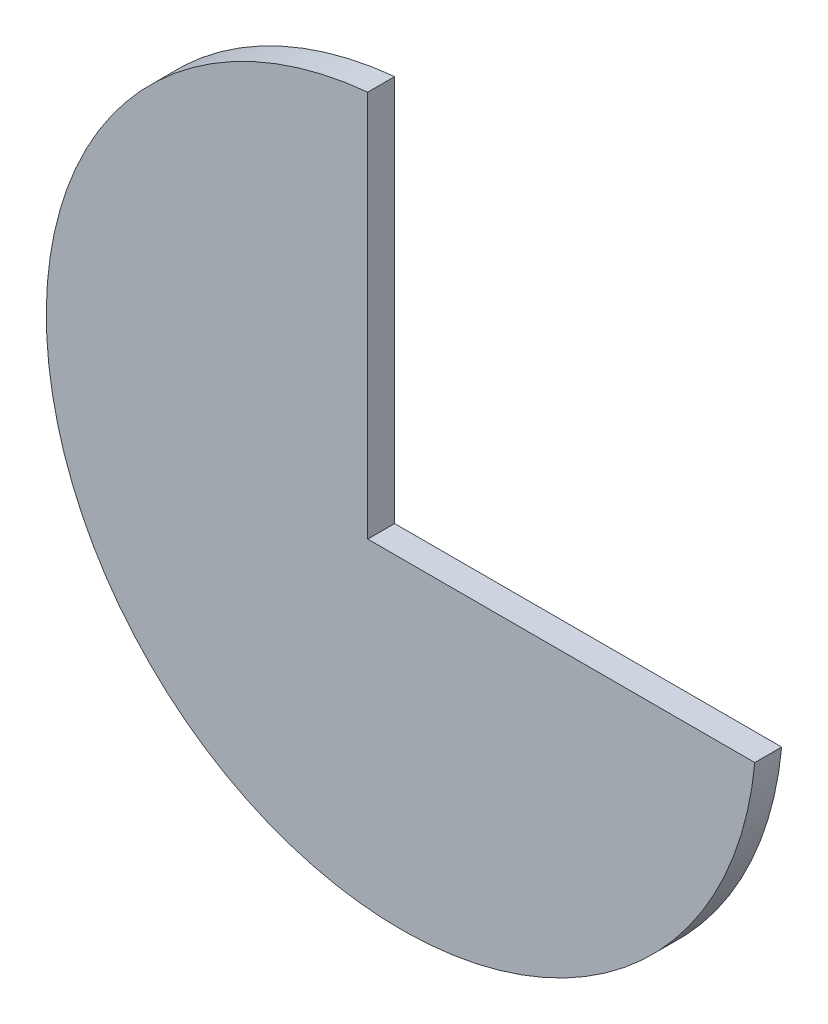
ISO-10303-21;
HEADER;
FILE_DESCRIPTION(('STEP AP214'),'2;1');
FILE_NAME('part.step','',(''),(''),'','','');
FILE_SCHEMA(('AUTOMOTIVE_DESIGN { 1 0 10303 214 1 1 1 1 }'));
ENDSEC;
DATA;
#1=APPLICATION_CONTEXT('core data for automotive mechanical design processes');
#2=APPLICATION_PROTOCOL_DEFINITION('international standard','automotive_design',2000,#1);
#3=PRODUCT_CONTEXT('',#1,'mechanical');
#4=PRODUCT('Part','Part','',(#3));
#5=PRODUCT_RELATED_PRODUCT_CATEGORY('part','',(#4));
#6=PRODUCT_DEFINITION_FORMATION('','',#4);
#7=PRODUCT_DEFINITION_CONTEXT('part definition',#1,'design');
#8=PRODUCT_DEFINITION('design','',#6,#7);
#9=PRODUCT_DEFINITION_SHAPE('','',#8);
#10=(LENGTH_UNIT() NAMED_UNIT(*) SI_UNIT(.MILLI.,.METRE.));
#11=(NAMED_UNIT(*) PLANE_ANGLE_UNIT() SI_UNIT($,.RADIAN.));
#12=(NAMED_UNIT(*) SI_UNIT($,.STERADIAN.) SOLID_ANGLE_UNIT());
#13=UNCERTAINTY_MEASURE_WITH_UNIT(LENGTH_MEASURE(1.E-05),#10,'distance_accuracy_value','');
#14=(GEOMETRIC_REPRESENTATION_CONTEXT(3) GLOBAL_UNCERTAINTY_ASSIGNED_CONTEXT((#13)) GLOBAL_UNIT_ASSIGNED_CONTEXT((#10,
#11,#12)) REPRESENTATION_CONTEXT('',''));
#15=CARTESIAN_POINT('',(0.,0.,0.));
#16=DIRECTION('',(0.,0.,1.));
#17=DIRECTION('',(1.,0.,0.));
#18=AXIS2_PLACEMENT_3D('',#15,#16,#17);
#19=CARTESIAN_POINT('',(-0.025,0.262971339514864,0.01));
#20=DIRECTION('',(1.,0.,0.));
#21=DIRECTION('',(0.,0.,-1.));
#22=AXIS2_PLACEMENT_3D('',#19,#20,#21);
#23=PLANE('',#22);
#24=DIRECTION('',(0.,-1.,0.));
#25=VECTOR('',#24,1.);
#26=CARTESIAN_POINT('',(-0.025,0.262971339514864,-0.01));
#27=LINE('',#26,#25);
#28=CARTESIAN_POINT('',(-0.025,0.262971339514864,-0.01));
#29=VERTEX_POINT('',#28);
#30=CARTESIAN_POINT('',(-0.025,-0.025,-0.01));
#31=VERTEX_POINT('',#30);
#32=EDGE_CURVE('E85',#29,#31,#27,.T.);
#33=ORIENTED_EDGE('',*,*,#32,.F.);
#34=DIRECTION('',(0.,0.,-1.));
#35=VECTOR('',#34,1.);
#36=CARTESIAN_POINT('',(-0.025,0.262971339514864,0.01));
#37=LINE('',#36,#35);
#38=CARTESIAN_POINT('',(-0.025,0.262971339514864,0.01));
#39=VERTEX_POINT('',#38);
#40=EDGE_CURVE('E11',#39,#29,#37,.T.);
#41=ORIENTED_EDGE('',*,*,#40,.F.);
#42=DIRECTION('',(0.,-1.,0.));
#43=VECTOR('',#42,1.);
#44=CARTESIAN_POINT('',(-0.025,0.262971339514864,0.01));
#45=LINE('',#44,#43);
#46=CARTESIAN_POINT('',(-0.025,-0.025,0.01));
#47=VERTEX_POINT('',#46);
#48=EDGE_CURVE('E78',#39,#47,#45,.T.);
#49=ORIENTED_EDGE('',*,*,#48,.T.);
#50=DIRECTION('',(0.,0.,-1.));
#51=VECTOR('',#50,1.);
#52=CARTESIAN_POINT('',(-0.025,-0.025,0.01));
#53=LINE('',#52,#51);
#54=EDGE_CURVE('E36',#47,#31,#53,.T.);
#55=ORIENTED_EDGE('',*,*,#54,.T.);
#56=EDGE_LOOP('',(#33,#41,#49,#55));
#57=FACE_BOUND('',#56,.T.);
#58=ADVANCED_FACE('F33',(#57),#23,.T.);
#59=CARTESIAN_POINT('',(0.,0.,0.01));
#60=DIRECTION('',(0.,0.,-1.));
#61=DIRECTION('',(-1.,0.,0.));
#62=AXIS2_PLACEMENT_3D('',#59,#60,#61);
#63=CYLINDRICAL_SURFACE('',#62,0.264157009004573);
#64=CARTESIAN_POINT('',(0.,0.,-0.01));
#65=DIRECTION('',(0.,0.,1.));
#66=DIRECTION('',(1.,0.,0.));
#67=AXIS2_PLACEMENT_3D('',#64,#65,#66);
#68=CIRCLE('',#67,0.264157009004573);
#69=CARTESIAN_POINT('',(0.262971339514864,-0.025,-0.01));
#70=VERTEX_POINT('',#69);
#71=EDGE_CURVE('E80',#29,#70,#68,.T.);
#72=ORIENTED_EDGE('',*,*,#71,.T.);
#73=DIRECTION('',(0.,0.,-1.));
#74=VECTOR('',#73,1.);
#75=CARTESIAN_POINT('',(0.262971339514864,-0.025,0.01));
#76=LINE('',#75,#74);
#77=CARTESIAN_POINT('',(0.262971339514864,-0.025,0.01));
#78=VERTEX_POINT('',#77);
#79=EDGE_CURVE('E42',#78,#70,#76,.T.);
#80=ORIENTED_EDGE('',*,*,#79,.F.);
#81=CARTESIAN_POINT('',(0.,0.,0.01));
#82=DIRECTION('',(0.,0.,1.));
#83=DIRECTION('',(1.,0.,0.));
#84=AXIS2_PLACEMENT_3D('',#81,#82,#83);
#85=CIRCLE('',#84,0.264157009004573);
#86=EDGE_CURVE('E74',#39,#78,#85,.T.);
#87=ORIENTED_EDGE('',*,*,#86,.F.);
#88=ORIENTED_EDGE('',*,*,#40,.T.);
#89=EDGE_LOOP('',(#72,#80,#87,#88));
#90=FACE_BOUND('',#89,.T.);
#91=ADVANCED_FACE('F89',(#90),#63,.T.);
#92=CARTESIAN_POINT('',(-0.025,-0.025,0.01));
#93=DIRECTION('',(0.,1.,0.));
#94=DIRECTION('',(0.,0.,1.));
#95=AXIS2_PLACEMENT_3D('',#92,#93,#94);
#96=PLANE('',#95);
#97=DIRECTION('',(1.,0.,0.));
#98=VECTOR('',#97,1.);
#99=CARTESIAN_POINT('',(-0.025,-0.025,-0.01));
#100=LINE('',#99,#98);
#101=EDGE_CURVE('E72',#31,#70,#100,.T.);
#102=ORIENTED_EDGE('',*,*,#101,.F.);
#103=ORIENTED_EDGE('',*,*,#54,.F.);
#104=DIRECTION('',(1.,0.,0.));
#105=VECTOR('',#104,1.);
#106=CARTESIAN_POINT('',(-0.025,-0.025,0.01));
#107=LINE('',#106,#105);
#108=EDGE_CURVE('E70',#47,#78,#107,.T.);
#109=ORIENTED_EDGE('',*,*,#108,.T.);
#110=ORIENTED_EDGE('',*,*,#79,.T.);
#111=EDGE_LOOP('',(#102,#103,#109,#110));
#112=FACE_BOUND('',#111,.T.);
#113=ADVANCED_FACE('F69',(#112),#96,.T.);
#114=CARTESIAN_POINT('',(0.,0.,0.01));
#115=DIRECTION('',(0.,0.,1.));
#116=DIRECTION('',(1.,0.,0.));
#117=AXIS2_PLACEMENT_3D('',#114,#115,#116);
#118=PLANE('',#117);
#119=ORIENTED_EDGE('',*,*,#48,.F.);
#120=ORIENTED_EDGE('',*,*,#86,.T.);
#121=ORIENTED_EDGE('',*,*,#108,.F.);
#122=EDGE_LOOP('',(#119,#120,#121));
#123=FACE_BOUND('',#122,.T.);
#124=ADVANCED_FACE('F77',(#123),#118,.T.);
#125=CARTESIAN_POINT('',(0.,0.,-0.01));
#126=DIRECTION('',(0.,0.,1.));
#127=DIRECTION('',(1.,0.,0.));
#128=AXIS2_PLACEMENT_3D('',#125,#126,#127);
#129=PLANE('',#128);
#130=ORIENTED_EDGE('',*,*,#32,.T.);
#131=ORIENTED_EDGE('',*,*,#101,.T.);
#132=ORIENTED_EDGE('',*,*,#71,.F.);
#133=EDGE_LOOP('',(#130,#131,#132));
#134=FACE_BOUND('',#133,.T.);
#135=ADVANCED_FACE('F88',(#134),#129,.F.);
#136=CLOSED_SHELL('',(#58,#91,#113,#124,#135));
#137=MANIFOLD_SOLID_BREP('B2',#136);
#138=ADVANCED_BREP_SHAPE_REPRESENTATION('',(#18,#137),#14);
#139=SHAPE_DEFINITION_REPRESENTATION(#9,#138);
ENDSEC;
END-ISO-10303-21;
